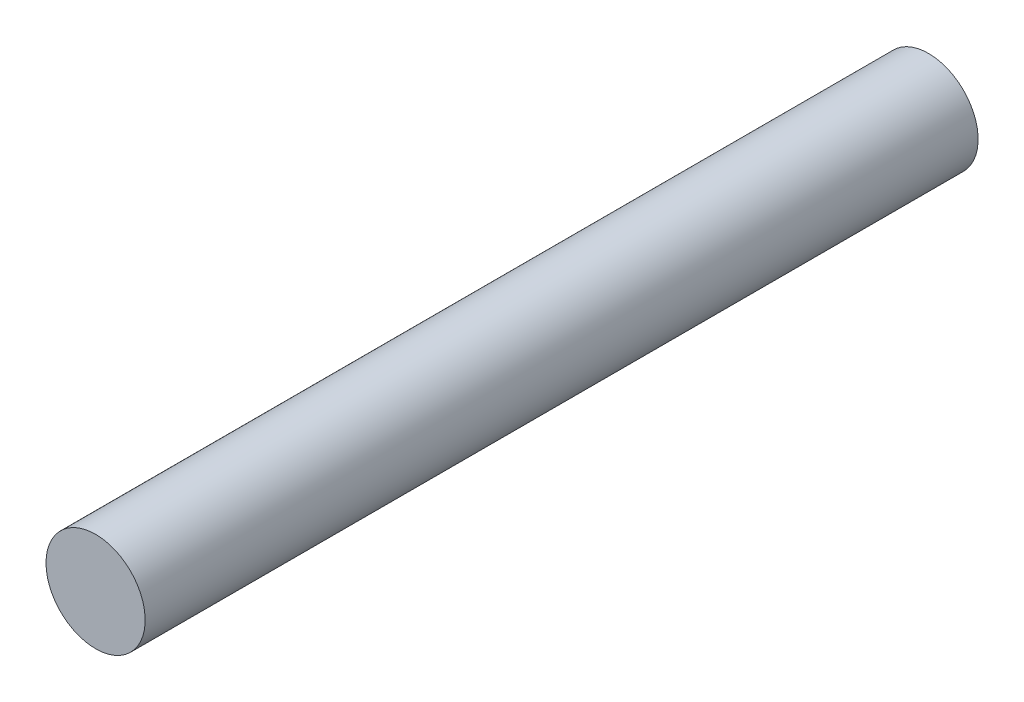
ISO-10303-21;
HEADER;
FILE_DESCRIPTION(('STEP AP214'),'2;1');
FILE_NAME('part.step','',(''),(''),'','','');
FILE_SCHEMA(('AUTOMOTIVE_DESIGN { 1 0 10303 214 1 1 1 1 }'));
ENDSEC;
DATA;
#1=APPLICATION_CONTEXT('core data for automotive mechanical design processes');
#2=APPLICATION_PROTOCOL_DEFINITION('international standard','automotive_design',2000,#1);
#3=PRODUCT_CONTEXT('',#1,'mechanical');
#4=PRODUCT('Part','Part','',(#3));
#5=PRODUCT_RELATED_PRODUCT_CATEGORY('part','',(#4));
#6=PRODUCT_DEFINITION_FORMATION('','',#4);
#7=PRODUCT_DEFINITION_CONTEXT('part definition',#1,'design');
#8=PRODUCT_DEFINITION('design','',#6,#7);
#9=PRODUCT_DEFINITION_SHAPE('','',#8);
#10=(LENGTH_UNIT() NAMED_UNIT(*) SI_UNIT(.MILLI.,.METRE.));
#11=(NAMED_UNIT(*) PLANE_ANGLE_UNIT() SI_UNIT($,.RADIAN.));
#12=(NAMED_UNIT(*) SI_UNIT($,.STERADIAN.) SOLID_ANGLE_UNIT());
#13=UNCERTAINTY_MEASURE_WITH_UNIT(LENGTH_MEASURE(1.E-05),#10,'distance_accuracy_value','');
#14=(GEOMETRIC_REPRESENTATION_CONTEXT(3) GLOBAL_UNCERTAINTY_ASSIGNED_CONTEXT((#13)) GLOBAL_UNIT_ASSIGNED_CONTEXT((#10,
#11,#12)) REPRESENTATION_CONTEXT('',''));
#15=CARTESIAN_POINT('',(0.,0.,0.));
#16=DIRECTION('',(0.,0.,1.));
#17=DIRECTION('',(1.,0.,0.));
#18=AXIS2_PLACEMENT_3D('',#15,#16,#17);
#19=CARTESIAN_POINT('',(0.,0.,42.));
#20=DIRECTION('',(0.,0.,-1.));
#21=DIRECTION('',(-1.,0.,0.));
#22=AXIS2_PLACEMENT_3D('',#19,#20,#21);
#23=CYLINDRICAL_SURFACE('',#22,2.5);
#24=CARTESIAN_POINT('',(0.,0.,42.));
#25=DIRECTION('',(0.,0.,1.));
#26=DIRECTION('',(1.,0.,0.));
#27=AXIS2_PLACEMENT_3D('',#24,#25,#26);
#28=CIRCLE('',#27,2.5);
#29=CARTESIAN_POINT('',(-2.5,0.,42.));
#30=VERTEX_POINT('',#29);
#31=EDGE_CURVE('E10',#30,#30,#28,.T.);
#32=CARTESIAN_POINT('',(0.,0.,0.));
#33=DIRECTION('',(0.,0.,1.));
#34=DIRECTION('',(1.,0.,0.));
#35=AXIS2_PLACEMENT_3D('',#32,#33,#34);
#36=CIRCLE('',#35,2.5);
#37=CARTESIAN_POINT('',(-2.5,0.,0.));
#38=VERTEX_POINT('',#37);
#39=EDGE_CURVE('E37',#38,#38,#36,.T.);
#40=CARTESIAN_POINT('',(-2.5,0.,42.));
#41=CARTESIAN_POINT('',(-2.5,0.,41.5625));
#42=CARTESIAN_POINT('',(-2.5,0.,41.125));
#43=CARTESIAN_POINT('',(-2.5,0.,40.25));
#44=CARTESIAN_POINT('',(-2.5,0.,39.8125));
#45=CARTESIAN_POINT('',(-2.5,0.,38.9375));
#46=CARTESIAN_POINT('',(-2.5,0.,38.5));
#47=CARTESIAN_POINT('',(-2.5,0.,37.625));
#48=CARTESIAN_POINT('',(-2.5,0.,37.1875));
#49=CARTESIAN_POINT('',(-2.5,0.,36.3125));
#50=CARTESIAN_POINT('',(-2.5,0.,35.875));
#51=CARTESIAN_POINT('',(-2.5,0.,35.));
#52=CARTESIAN_POINT('',(-2.5,0.,34.5625));
#53=CARTESIAN_POINT('',(-2.5,0.,33.6875));
#54=CARTESIAN_POINT('',(-2.5,0.,33.25));
#55=CARTESIAN_POINT('',(-2.5,0.,32.375));
#56=CARTESIAN_POINT('',(-2.5,0.,31.9375));
#57=CARTESIAN_POINT('',(-2.5,0.,31.0625));
#58=CARTESIAN_POINT('',(-2.5,0.,30.625));
#59=CARTESIAN_POINT('',(-2.5,0.,29.75));
#60=CARTESIAN_POINT('',(-2.5,0.,29.3125));
#61=CARTESIAN_POINT('',(-2.5,0.,28.4375));
#62=CARTESIAN_POINT('',(-2.5,0.,28.));
#63=CARTESIAN_POINT('',(-2.5,0.,27.125));
#64=CARTESIAN_POINT('',(-2.5,0.,26.6875));
#65=CARTESIAN_POINT('',(-2.5,0.,25.8125));
#66=CARTESIAN_POINT('',(-2.5,0.,25.375));
#67=CARTESIAN_POINT('',(-2.5,0.,24.5));
#68=CARTESIAN_POINT('',(-2.5,0.,24.0625));
#69=CARTESIAN_POINT('',(-2.5,0.,23.1875));
#70=CARTESIAN_POINT('',(-2.5,0.,22.75));
#71=CARTESIAN_POINT('',(-2.5,0.,21.875));
#72=CARTESIAN_POINT('',(-2.5,0.,21.4375));
#73=CARTESIAN_POINT('',(-2.5,0.,20.5625));
#74=CARTESIAN_POINT('',(-2.5,0.,20.125));
#75=CARTESIAN_POINT('',(-2.5,0.,19.25));
#76=CARTESIAN_POINT('',(-2.5,0.,18.8125));
#77=CARTESIAN_POINT('',(-2.5,0.,17.9375));
#78=CARTESIAN_POINT('',(-2.5,0.,17.5));
#79=CARTESIAN_POINT('',(-2.5,0.,16.625));
#80=CARTESIAN_POINT('',(-2.5,0.,16.1875));
#81=CARTESIAN_POINT('',(-2.5,0.,15.3125));
#82=CARTESIAN_POINT('',(-2.5,0.,14.875));
#83=CARTESIAN_POINT('',(-2.5,0.,14.));
#84=CARTESIAN_POINT('',(-2.5,0.,13.5625));
#85=CARTESIAN_POINT('',(-2.5,0.,12.6875));
#86=CARTESIAN_POINT('',(-2.5,0.,12.25));
#87=CARTESIAN_POINT('',(-2.5,0.,11.375));
#88=CARTESIAN_POINT('',(-2.5,0.,10.9375));
#89=CARTESIAN_POINT('',(-2.5,0.,10.0625));
#90=CARTESIAN_POINT('',(-2.5,0.,9.625));
#91=CARTESIAN_POINT('',(-2.5,0.,8.75));
#92=CARTESIAN_POINT('',(-2.5,0.,8.3125));
#93=CARTESIAN_POINT('',(-2.5,0.,7.4375));
#94=CARTESIAN_POINT('',(-2.5,0.,7.));
#95=CARTESIAN_POINT('',(-2.5,0.,6.125));
#96=CARTESIAN_POINT('',(-2.5,0.,5.6875));
#97=CARTESIAN_POINT('',(-2.5,0.,4.8125));
#98=CARTESIAN_POINT('',(-2.5,0.,4.375));
#99=CARTESIAN_POINT('',(-2.5,0.,3.5));
#100=CARTESIAN_POINT('',(-2.5,0.,3.0625));
#101=CARTESIAN_POINT('',(-2.5,0.,2.1875));
#102=CARTESIAN_POINT('',(-2.5,0.,1.75));
#103=CARTESIAN_POINT('',(-2.5,0.,0.875000000000001));
#104=CARTESIAN_POINT('',(-2.5,0.,0.4375));
#105=CARTESIAN_POINT('',(-2.5,0.,0.));
#106=B_SPLINE_CURVE_WITH_KNOTS('',3,(#40,#41,#42,#43,#44,#45,#46,#47,#48,#49,#50,#51,#52,#53,
#54,#55,#56,#57,#58,#59,#60,#61,#62,#63,#64,#65,#66,#67,#68,#69,#70,#71,#72,#73,#74,#75,#76,#77,
#78,#79,#80,#81,#82,#83,#84,#85,#86,#87,#88,#89,#90,#91,#92,#93,#94,#95,#96,#97,#98,#99,#100,
#101,#102,#103,#104,#105),.UNSPECIFIED.,.F.,.F.,(4,2,2,2,2,2,2,2,2,2,2,2,2,2,2,2,2,2,2,2,2,2,2,
2,2,2,2,2,2,2,2,2,4),(0.,1.3125,2.625,3.9375,5.25,6.56250000000001,7.875,9.1875,10.5,11.8125,
13.125,14.4375,15.75,17.0625,18.375,19.6875,21.,22.3125,23.625,24.9375,26.25,27.5625,28.875,
30.1875,31.5,32.8125,34.125,35.4375,36.75,38.0625,39.375,40.6875,42.),.UNSPECIFIED.);
#107=EDGE_CURVE('BSEAM34',#30,#38,#106,.T.);
#108=ORIENTED_EDGE('',*,*,#31,.F.);
#109=ORIENTED_EDGE('',*,*,#39,.T.);
#110=ORIENTED_EDGE('',*,*,#107,.T.);
#111=ORIENTED_EDGE('',*,*,#107,.F.);
#112=EDGE_LOOP('',(#108,#110,#109,#111));
#113=FACE_BOUND('',#112,.T.);
#114=ADVANCED_FACE('F34',(#113),#23,.T.);
#115=CARTESIAN_POINT('',(0.,0.,42.));
#116=DIRECTION('',(0.,0.,1.));
#117=DIRECTION('',(1.,0.,0.));
#118=AXIS2_PLACEMENT_3D('',#115,#116,#117);
#119=PLANE('',#118);
#120=ORIENTED_EDGE('',*,*,#31,.T.);
#121=EDGE_LOOP('',(#120));
#122=FACE_BOUND('',#121,.T.);
#123=ADVANCED_FACE('F49',(#122),#119,.T.);
#124=CARTESIAN_POINT('',(0.,0.,0.));
#125=DIRECTION('',(0.,0.,1.));
#126=DIRECTION('',(1.,0.,0.));
#127=AXIS2_PLACEMENT_3D('',#124,#125,#126);
#128=PLANE('',#127);
#129=ORIENTED_EDGE('',*,*,#39,.F.);
#130=EDGE_LOOP('',(#129));
#131=FACE_BOUND('',#130,.T.);
#132=ADVANCED_FACE('F47',(#131),#128,.F.);
#133=CLOSED_SHELL('',(#114,#123,#132));
#134=MANIFOLD_SOLID_BREP('B2',#133);
#135=ADVANCED_BREP_SHAPE_REPRESENTATION('',(#18,#134),#14);
#136=SHAPE_DEFINITION_REPRESENTATION(#9,#135);
ENDSEC;
END-ISO-10303-21;
